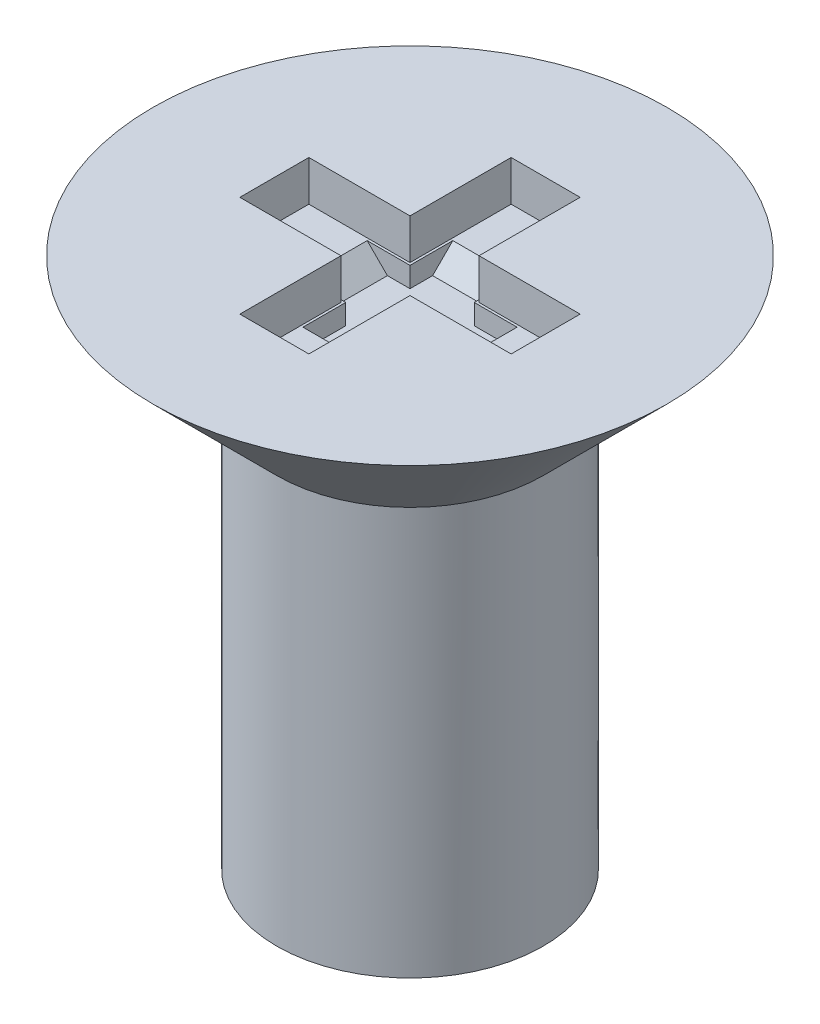
ISO-10303-21;
HEADER;
FILE_DESCRIPTION(('STEP AP214'),'2;1');
FILE_NAME('part.step','',(''),(''),'','','');
FILE_SCHEMA(('AUTOMOTIVE_DESIGN { 1 0 10303 214 1 1 1 1 }'));
ENDSEC;
DATA;
#1=APPLICATION_CONTEXT('core data for automotive mechanical design processes');
#2=APPLICATION_PROTOCOL_DEFINITION('international standard','automotive_design',2000,#1);
#3=PRODUCT_CONTEXT('',#1,'mechanical');
#4=PRODUCT('Part','Part','',(#3));
#5=PRODUCT_RELATED_PRODUCT_CATEGORY('part','',(#4));
#6=PRODUCT_DEFINITION_FORMATION('','',#4);
#7=PRODUCT_DEFINITION_CONTEXT('part definition',#1,'design');
#8=PRODUCT_DEFINITION('design','',#6,#7);
#9=PRODUCT_DEFINITION_SHAPE('','',#8);
#10=(LENGTH_UNIT() NAMED_UNIT(*) SI_UNIT(.MILLI.,.METRE.));
#11=(NAMED_UNIT(*) PLANE_ANGLE_UNIT() SI_UNIT($,.RADIAN.));
#12=(NAMED_UNIT(*) SI_UNIT($,.STERADIAN.) SOLID_ANGLE_UNIT());
#13=UNCERTAINTY_MEASURE_WITH_UNIT(LENGTH_MEASURE(1.E-05),#10,'distance_accuracy_value','');
#14=(GEOMETRIC_REPRESENTATION_CONTEXT(3) GLOBAL_UNCERTAINTY_ASSIGNED_CONTEXT((#13)) GLOBAL_UNIT_ASSIGNED_CONTEXT((#10,
#11,#12)) REPRESENTATION_CONTEXT('',''));
#15=CARTESIAN_POINT('',(0.,0.,0.));
#16=DIRECTION('',(0.,0.,1.));
#17=DIRECTION('',(1.,0.,0.));
#18=AXIS2_PLACEMENT_3D('',#15,#16,#17);
#19=CARTESIAN_POINT('',(-0.58416716291429,0.67306716291429,-0.3429));
#20=DIRECTION('',(0.,-1.,0.));
#21=DIRECTION('',(0.,0.,-1.));
#22=AXIS2_PLACEMENT_3D('',#19,#20,#21);
#23=PLANE('',#22);
#24=DIRECTION('',(1.,0.,0.));
#25=VECTOR('',#24,1.);
#26=CARTESIAN_POINT('',(-0.58416716291429,0.67306716291429,0.3429));
#27=LINE('',#26,#25);
#28=CARTESIAN_POINT('',(-0.58416716291429,0.67306716291429,0.3429));
#29=VERTEX_POINT('',#28);
#30=CARTESIAN_POINT('',(-0.3429,0.67306716291429,0.3429));
#31=VERTEX_POINT('',#30);
#32=EDGE_CURVE('E182',#29,#31,#27,.T.);
#33=ORIENTED_EDGE('',*,*,#32,.T.);
#34=DIRECTION('',(0.,0.,-1.));
#35=VECTOR('',#34,1.);
#36=CARTESIAN_POINT('',(-0.3429,0.67306716291429,0.));
#37=LINE('',#36,#35);
#38=CARTESIAN_POINT('',(-0.3429,0.67306716291429,0.58416716291429));
#39=VERTEX_POINT('',#38);
#40=EDGE_CURVE('E20',#39,#31,#37,.T.);
#41=ORIENTED_EDGE('',*,*,#40,.F.);
#42=DIRECTION('',(1.,0.,0.));
#43=VECTOR('',#42,1.);
#44=CARTESIAN_POINT('',(-0.3429,0.67306716291429,0.58416716291429));
#45=LINE('',#44,#43);
#46=CARTESIAN_POINT('',(0.3429,0.67306716291429,0.58416716291429));
#47=VERTEX_POINT('',#46);
#48=EDGE_CURVE('E179',#39,#47,#45,.T.);
#49=ORIENTED_EDGE('',*,*,#48,.T.);
#50=DIRECTION('',(0.,0.,-1.));
#51=VECTOR('',#50,1.);
#52=CARTESIAN_POINT('',(0.3429,0.67306716291429,-0.3429));
#53=LINE('',#52,#51);
#54=CARTESIAN_POINT('',(0.3429,0.67306716291429,0.3429));
#55=VERTEX_POINT('',#54);
#56=EDGE_CURVE('E194',#47,#55,#53,.T.);
#57=ORIENTED_EDGE('',*,*,#56,.T.);
#58=DIRECTION('',(1.,0.,0.));
#59=VECTOR('',#58,1.);
#60=CARTESIAN_POINT('',(-0.58416716291429,0.67306716291429,0.3429));
#61=LINE('',#60,#59);
#62=CARTESIAN_POINT('',(0.58416716291429,0.67306716291429,0.3429));
#63=VERTEX_POINT('',#62);
#64=EDGE_CURVE('E206',#55,#63,#61,.T.);
#65=ORIENTED_EDGE('',*,*,#64,.T.);
#66=DIRECTION('',(0.,0.,1.));
#67=VECTOR('',#66,1.);
#68=CARTESIAN_POINT('',(0.58416716291429,0.67306716291429,-0.3429));
#69=LINE('',#68,#67);
#70=CARTESIAN_POINT('',(0.58416716291429,0.67306716291429,-0.3429));
#71=VERTEX_POINT('',#70);
#72=EDGE_CURVE('E209',#63,#71,#69,.F.);
#73=ORIENTED_EDGE('',*,*,#72,.T.);
#74=DIRECTION('',(1.,0.,0.));
#75=VECTOR('',#74,1.);
#76=CARTESIAN_POINT('',(0.,0.67306716291429,-0.3429));
#77=LINE('',#76,#75);
#78=CARTESIAN_POINT('',(0.3429,0.67306716291429,-0.3429));
#79=VERTEX_POINT('',#78);
#80=EDGE_CURVE('E210',#79,#71,#77,.T.);
#81=ORIENTED_EDGE('',*,*,#80,.F.);
#82=DIRECTION('',(0.,0.,-1.));
#83=VECTOR('',#82,1.);
#84=CARTESIAN_POINT('',(0.3429,0.67306716291429,-0.3429));
#85=LINE('',#84,#83);
#86=CARTESIAN_POINT('',(0.3429,0.67306716291429,-0.58416716291429));
#87=VERTEX_POINT('',#86);
#88=EDGE_CURVE('E215',#79,#87,#85,.T.);
#89=ORIENTED_EDGE('',*,*,#88,.T.);
#90=DIRECTION('',(-1.,0.,0.));
#91=VECTOR('',#90,1.);
#92=CARTESIAN_POINT('',(-0.3429,0.67306716291429,-0.58416716291429));
#93=LINE('',#92,#91);
#94=CARTESIAN_POINT('',(-0.3429,0.67306716291429,-0.58416716291429));
#95=VERTEX_POINT('',#94);
#96=EDGE_CURVE('E217',#87,#95,#93,.T.);
#97=ORIENTED_EDGE('',*,*,#96,.T.);
#98=DIRECTION('',(0.,0.,-1.));
#99=VECTOR('',#98,1.);
#100=CARTESIAN_POINT('',(-0.3429,0.67306716291429,0.));
#101=LINE('',#100,#99);
#102=CARTESIAN_POINT('',(-0.3429,0.67306716291429,-0.3429));
#103=VERTEX_POINT('',#102);
#104=EDGE_CURVE('E223',#103,#95,#101,.T.);
#105=ORIENTED_EDGE('',*,*,#104,.F.);
#106=DIRECTION('',(1.,0.,0.));
#107=VECTOR('',#106,1.);
#108=CARTESIAN_POINT('',(0.,0.67306716291429,-0.3429));
#109=LINE('',#108,#107);
#110=CARTESIAN_POINT('',(-0.58416716291429,0.67306716291429,-0.3429));
#111=VERTEX_POINT('',#110);
#112=EDGE_CURVE('E225',#111,#103,#109,.T.);
#113=ORIENTED_EDGE('',*,*,#112,.F.);
#114=DIRECTION('',(0.,0.,1.));
#115=VECTOR('',#114,1.);
#116=CARTESIAN_POINT('',(-0.58416716291429,0.67306716291429,-0.3429));
#117=LINE('',#116,#115);
#118=EDGE_CURVE('E228',#111,#29,#117,.T.);
#119=ORIENTED_EDGE('',*,*,#118,.T.);
#120=EDGE_LOOP('',(#33,#41,#49,#57,#65,#73,#81,#89,#97,#105,#113,#119));
#121=FACE_BOUND('',#120,.T.);
#122=ADVANCED_FACE('F17',(#121),#23,.F.);
#123=CARTESIAN_POINT('',(0.,-4.350004,0.));
#124=DIRECTION('',(0.,1.,0.));
#125=DIRECTION('',(0.,0.,1.));
#126=AXIS2_PLACEMENT_3D('',#123,#124,#125);
#127=PLANE('',#126);
#128=CARTESIAN_POINT('',(0.,-4.350004,0.));
#129=DIRECTION('',(0.,1.,0.));
#130=DIRECTION('',(0.,0.,1.));
#131=AXIS2_PLACEMENT_3D('',#128,#129,#130);
#132=CIRCLE('',#131,1.4224);
#133=CARTESIAN_POINT('',(0.,-4.350004,1.4224));
#134=VERTEX_POINT('',#133);
#135=EDGE_CURVE('E200',#134,#134,#132,.T.);
#136=ORIENTED_EDGE('',*,*,#135,.F.);
#137=EDGE_LOOP('',(#136));
#138=FACE_BOUND('',#137,.T.);
#139=ADVANCED_FACE('F553',(#138),#127,.F.);
#140=CARTESIAN_POINT('',(-0.3429,0.,0.));
#141=DIRECTION('',(1.,0.,0.));
#142=DIRECTION('',(0.,0.,-1.));
#143=AXIS2_PLACEMENT_3D('',#140,#141,#142);
#144=PLANE('',#143);
#145=ORIENTED_EDGE('',*,*,#40,.T.);
#146=DIRECTION('',(0.,1.,0.));
#147=VECTOR('',#146,1.);
#148=CARTESIAN_POINT('',(-0.3429,0.,0.3429));
#149=LINE('',#148,#147);
#150=CARTESIAN_POINT('',(-0.3429,0.889,0.3429));
#151=VERTEX_POINT('',#150);
#152=EDGE_CURVE('E185',#31,#151,#149,.T.);
#153=ORIENTED_EDGE('',*,*,#152,.T.);
#154=DIRECTION('',(0.,0.,1.));
#155=VECTOR('',#154,1.);
#156=CARTESIAN_POINT('',(-0.3429,0.889,0.));
#157=LINE('',#156,#155);
#158=CARTESIAN_POINT('',(-0.3429,0.889,0.8001));
#159=VERTEX_POINT('',#158);
#160=EDGE_CURVE('E190',#159,#151,#157,.F.);
#161=ORIENTED_EDGE('',*,*,#160,.F.);
#162=DIRECTION('',(0.,-0.707106781186548,-0.707106781186548));
#163=VECTOR('',#162,1.);
#164=CARTESIAN_POINT('',(-0.3429,0.889,0.8001));
#165=LINE('',#164,#163);
#166=EDGE_CURVE('E187',#159,#39,#165,.T.);
#167=ORIENTED_EDGE('',*,*,#166,.T.);
#168=EDGE_LOOP('',(#145,#153,#161,#167));
#169=FACE_BOUND('',#168,.T.);
#170=ADVANCED_FACE('F188',(#169),#144,.T.);
#171=CARTESIAN_POINT('',(0.,0.,0.3429));
#172=DIRECTION('',(0.,0.,1.));
#173=DIRECTION('',(1.,0.,0.));
#174=AXIS2_PLACEMENT_3D('',#171,#172,#173);
#175=PLANE('',#174);
#176=DIRECTION('',(0.707106781186548,-0.707106781186548,0.));
#177=VECTOR('',#176,1.);
#178=CARTESIAN_POINT('',(-1.2319,1.3208,0.3429));
#179=LINE('',#178,#177);
#180=CARTESIAN_POINT('',(-0.8001,0.889,0.3429));
#181=VERTEX_POINT('',#180);
#182=EDGE_CURVE('E229',#29,#181,#179,.F.);
#183=ORIENTED_EDGE('',*,*,#182,.T.);
#184=DIRECTION('',(1.,0.,0.));
#185=VECTOR('',#184,1.);
#186=CARTESIAN_POINT('',(0.,0.889,0.3429));
#187=LINE('',#186,#185);
#188=EDGE_CURVE('E238',#151,#181,#187,.F.);
#189=ORIENTED_EDGE('',*,*,#188,.F.);
#190=ORIENTED_EDGE('',*,*,#152,.F.);
#191=ORIENTED_EDGE('',*,*,#32,.F.);
#192=EDGE_LOOP('',(#183,#189,#190,#191));
#193=FACE_BOUND('',#192,.T.);
#194=ADVANCED_FACE('F548',(#193),#175,.F.);
#195=CARTESIAN_POINT('',(-1.2319,1.3208,-0.3429));
#196=DIRECTION('',(-0.707106781186548,-0.707106781186548,0.));
#197=DIRECTION('',(0.707106781186548,-0.707106781186548,0.));
#198=AXIS2_PLACEMENT_3D('',#195,#196,#197);
#199=PLANE('',#198);
#200=ORIENTED_EDGE('',*,*,#182,.F.);
#201=ORIENTED_EDGE('',*,*,#118,.F.);
#202=DIRECTION('',(0.707106781186548,-0.707106781186548,0.));
#203=VECTOR('',#202,1.);
#204=CARTESIAN_POINT('',(-0.8001,0.889,-0.3429));
#205=LINE('',#204,#203);
#206=CARTESIAN_POINT('',(-0.8001,0.889,-0.3429));
#207=VERTEX_POINT('',#206);
#208=EDGE_CURVE('E227',#207,#111,#205,.T.);
#209=ORIENTED_EDGE('',*,*,#208,.F.);
#210=DIRECTION('',(0.,0.,1.));
#211=VECTOR('',#210,1.);
#212=CARTESIAN_POINT('',(-0.8001,0.889,0.));
#213=LINE('',#212,#211);
#214=EDGE_CURVE('E241',#181,#207,#213,.F.);
#215=ORIENTED_EDGE('',*,*,#214,.F.);
#216=EDGE_LOOP('',(#200,#201,#209,#215));
#217=FACE_BOUND('',#216,.T.);
#218=ADVANCED_FACE('F315',(#217),#199,.F.);
#219=CARTESIAN_POINT('',(0.,0.,-0.3429));
#220=DIRECTION('',(0.,0.,1.));
#221=DIRECTION('',(1.,0.,0.));
#222=AXIS2_PLACEMENT_3D('',#219,#220,#221);
#223=PLANE('',#222);
#224=ORIENTED_EDGE('',*,*,#112,.T.);
#225=DIRECTION('',(0.,1.,0.));
#226=VECTOR('',#225,1.);
#227=CARTESIAN_POINT('',(-0.3429,0.,-0.3429));
#228=LINE('',#227,#226);
#229=CARTESIAN_POINT('',(-0.3429,0.889,-0.3429));
#230=VERTEX_POINT('',#229);
#231=EDGE_CURVE('E222',#230,#103,#228,.F.);
#232=ORIENTED_EDGE('',*,*,#231,.F.);
#233=DIRECTION('',(1.,0.,0.));
#234=VECTOR('',#233,1.);
#235=CARTESIAN_POINT('',(0.,0.889,-0.3429));
#236=LINE('',#235,#234);
#237=EDGE_CURVE('E295',#207,#230,#236,.T.);
#238=ORIENTED_EDGE('',*,*,#237,.F.);
#239=ORIENTED_EDGE('',*,*,#208,.T.);
#240=EDGE_LOOP('',(#224,#232,#238,#239));
#241=FACE_BOUND('',#240,.T.);
#242=ADVANCED_FACE('F318',(#241),#223,.T.);
#243=CARTESIAN_POINT('',(-0.3429,0.,0.));
#244=DIRECTION('',(1.,0.,0.));
#245=DIRECTION('',(0.,0.,-1.));
#246=AXIS2_PLACEMENT_3D('',#243,#244,#245);
#247=PLANE('',#246);
#248=DIRECTION('',(0.,0.,1.));
#249=VECTOR('',#248,1.);
#250=CARTESIAN_POINT('',(-0.3429,0.889,0.));
#251=LINE('',#250,#249);
#252=CARTESIAN_POINT('',(-0.3429,0.889,-0.8001));
#253=VERTEX_POINT('',#252);
#254=EDGE_CURVE('E292',#230,#253,#251,.F.);
#255=ORIENTED_EDGE('',*,*,#254,.F.);
#256=ORIENTED_EDGE('',*,*,#231,.T.);
#257=ORIENTED_EDGE('',*,*,#104,.T.);
#258=DIRECTION('',(0.,0.707106781186548,-0.707106781186547));
#259=VECTOR('',#258,1.);
#260=CARTESIAN_POINT('',(-0.3429,0.673094527152424,-0.584194527152424));
#261=LINE('',#260,#259);
#262=EDGE_CURVE('E220',#95,#253,#261,.T.);
#263=ORIENTED_EDGE('',*,*,#262,.T.);
#264=EDGE_LOOP('',(#255,#256,#257,#263));
#265=FACE_BOUND('',#264,.T.);
#266=ADVANCED_FACE('F321',(#265),#247,.T.);
#267=CARTESIAN_POINT('',(-0.3429,0.6731,-0.5842));
#268=DIRECTION('',(0.,-0.707106781186548,-0.707106781186548));
#269=DIRECTION('',(0.,0.707106781186548,-0.707106781186548));
#270=AXIS2_PLACEMENT_3D('',#267,#268,#269);
#271=PLANE('',#270);
#272=DIRECTION('',(0.,0.707106781186548,-0.707106781186548));
#273=VECTOR('',#272,1.);
#274=CARTESIAN_POINT('',(0.3429,0.6731,-0.5842));
#275=LINE('',#274,#273);
#276=CARTESIAN_POINT('',(0.3429,0.889,-0.8001));
#277=VERTEX_POINT('',#276);
#278=EDGE_CURVE('E213',#87,#277,#275,.T.);
#279=ORIENTED_EDGE('',*,*,#278,.T.);
#280=DIRECTION('',(1.,0.,0.));
#281=VECTOR('',#280,1.);
#282=CARTESIAN_POINT('',(0.,0.889,-0.8001));
#283=LINE('',#282,#281);
#284=EDGE_CURVE('E289',#253,#277,#283,.T.);
#285=ORIENTED_EDGE('',*,*,#284,.F.);
#286=ORIENTED_EDGE('',*,*,#262,.F.);
#287=ORIENTED_EDGE('',*,*,#96,.F.);
#288=EDGE_LOOP('',(#279,#285,#286,#287));
#289=FACE_BOUND('',#288,.T.);
#290=ADVANCED_FACE('F326',(#289),#271,.F.);
#291=CARTESIAN_POINT('',(0.3429,0.,0.));
#292=DIRECTION('',(1.,0.,0.));
#293=DIRECTION('',(0.,0.,-1.));
#294=AXIS2_PLACEMENT_3D('',#291,#292,#293);
#295=PLANE('',#294);
#296=ORIENTED_EDGE('',*,*,#278,.F.);
#297=ORIENTED_EDGE('',*,*,#88,.F.);
#298=DIRECTION('',(0.,1.,0.));
#299=VECTOR('',#298,1.);
#300=CARTESIAN_POINT('',(0.3429,0.,-0.3429));
#301=LINE('',#300,#299);
#302=CARTESIAN_POINT('',(0.3429,0.889,-0.3429));
#303=VERTEX_POINT('',#302);
#304=EDGE_CURVE('E212',#303,#79,#301,.F.);
#305=ORIENTED_EDGE('',*,*,#304,.F.);
#306=DIRECTION('',(0.,0.,1.));
#307=VECTOR('',#306,1.);
#308=CARTESIAN_POINT('',(0.3429,0.889,0.));
#309=LINE('',#308,#307);
#310=EDGE_CURVE('E282',#277,#303,#309,.T.);
#311=ORIENTED_EDGE('',*,*,#310,.F.);
#312=EDGE_LOOP('',(#296,#297,#305,#311));
#313=FACE_BOUND('',#312,.T.);
#314=ADVANCED_FACE('F331',(#313),#295,.F.);
#315=CARTESIAN_POINT('',(0.,0.,-0.3429));
#316=DIRECTION('',(0.,0.,1.));
#317=DIRECTION('',(1.,0.,0.));
#318=AXIS2_PLACEMENT_3D('',#315,#316,#317);
#319=PLANE('',#318);
#320=DIRECTION('',(1.,0.,0.));
#321=VECTOR('',#320,1.);
#322=CARTESIAN_POINT('',(0.,0.889,-0.3429));
#323=LINE('',#322,#321);
#324=CARTESIAN_POINT('',(0.8001,0.889,-0.3429));
#325=VERTEX_POINT('',#324);
#326=EDGE_CURVE('E277',#303,#325,#323,.T.);
#327=ORIENTED_EDGE('',*,*,#326,.F.);
#328=ORIENTED_EDGE('',*,*,#304,.T.);
#329=ORIENTED_EDGE('',*,*,#80,.T.);
#330=DIRECTION('',(0.707106781186548,0.707106781186548,0.));
#331=VECTOR('',#330,1.);
#332=CARTESIAN_POINT('',(0.58416716291429,0.67306716291429,-0.3429));
#333=LINE('',#332,#331);
#334=EDGE_CURVE('E270',#71,#325,#333,.T.);
#335=ORIENTED_EDGE('',*,*,#334,.T.);
#336=EDGE_LOOP('',(#327,#328,#329,#335));
#337=FACE_BOUND('',#336,.T.);
#338=ADVANCED_FACE('F334',(#337),#319,.T.);
#339=CARTESIAN_POINT('',(0.58416716291429,0.67306716291429,-0.3429));
#340=DIRECTION('',(0.707106781186548,-0.707106781186548,0.));
#341=DIRECTION('',(0.707106781186548,0.707106781186548,0.));
#342=AXIS2_PLACEMENT_3D('',#339,#340,#341);
#343=PLANE('',#342);
#344=DIRECTION('',(0.707106781186548,0.707106781186548,0.));
#345=VECTOR('',#344,1.);
#346=CARTESIAN_POINT('',(0.58416716291429,0.67306716291429,0.3429));
#347=LINE('',#346,#345);
#348=CARTESIAN_POINT('',(0.8001,0.889,0.3429));
#349=VERTEX_POINT('',#348);
#350=EDGE_CURVE('E208',#63,#349,#347,.T.);
#351=ORIENTED_EDGE('',*,*,#350,.T.);
#352=DIRECTION('',(0.,0.,1.));
#353=VECTOR('',#352,1.);
#354=CARTESIAN_POINT('',(0.8001,0.889,0.));
#355=LINE('',#354,#353);
#356=EDGE_CURVE('E265',#325,#349,#355,.T.);
#357=ORIENTED_EDGE('',*,*,#356,.F.);
#358=ORIENTED_EDGE('',*,*,#334,.F.);
#359=ORIENTED_EDGE('',*,*,#72,.F.);
#360=EDGE_LOOP('',(#351,#357,#358,#359));
#361=FACE_BOUND('',#360,.T.);
#362=ADVANCED_FACE('F339',(#361),#343,.F.);
#363=CARTESIAN_POINT('',(0.,0.,0.3429));
#364=DIRECTION('',(0.,0.,1.));
#365=DIRECTION('',(1.,0.,0.));
#366=AXIS2_PLACEMENT_3D('',#363,#364,#365);
#367=PLANE('',#366);
#368=ORIENTED_EDGE('',*,*,#350,.F.);
#369=ORIENTED_EDGE('',*,*,#64,.F.);
#370=DIRECTION('',(0.,1.,0.));
#371=VECTOR('',#370,1.);
#372=CARTESIAN_POINT('',(0.3429,0.,0.3429));
#373=LINE('',#372,#371);
#374=CARTESIAN_POINT('',(0.3429,0.889,0.3429));
#375=VERTEX_POINT('',#374);
#376=EDGE_CURVE('E205',#55,#375,#373,.T.);
#377=ORIENTED_EDGE('',*,*,#376,.T.);
#378=DIRECTION('',(1.,0.,0.));
#379=VECTOR('',#378,1.);
#380=CARTESIAN_POINT('',(0.,0.889,0.3429));
#381=LINE('',#380,#379);
#382=EDGE_CURVE('E261',#349,#375,#381,.F.);
#383=ORIENTED_EDGE('',*,*,#382,.F.);
#384=EDGE_LOOP('',(#368,#369,#377,#383));
#385=FACE_BOUND('',#384,.T.);
#386=ADVANCED_FACE('F343',(#385),#367,.F.);
#387=CARTESIAN_POINT('',(0.3429,0.,0.));
#388=DIRECTION('',(1.,0.,0.));
#389=DIRECTION('',(0.,0.,-1.));
#390=AXIS2_PLACEMENT_3D('',#387,#388,#389);
#391=PLANE('',#390);
#392=DIRECTION('',(0.,0.707106781186548,0.707106781186548));
#393=VECTOR('',#392,1.);
#394=CARTESIAN_POINT('',(0.3429,0.673094527152424,0.584194527152424));
#395=LINE('',#394,#393);
#396=CARTESIAN_POINT('',(0.3429,0.889,0.8001));
#397=VERTEX_POINT('',#396);
#398=EDGE_CURVE('E198',#47,#397,#395,.T.);
#399=ORIENTED_EDGE('',*,*,#398,.T.);
#400=DIRECTION('',(0.,0.,1.));
#401=VECTOR('',#400,1.);
#402=CARTESIAN_POINT('',(0.3429,0.889,0.));
#403=LINE('',#402,#401);
#404=EDGE_CURVE('E264',#375,#397,#403,.T.);
#405=ORIENTED_EDGE('',*,*,#404,.F.);
#406=ORIENTED_EDGE('',*,*,#376,.F.);
#407=ORIENTED_EDGE('',*,*,#56,.F.);
#408=EDGE_LOOP('',(#399,#405,#406,#407));
#409=FACE_BOUND('',#408,.T.);
#410=ADVANCED_FACE('F347',(#409),#391,.F.);
#411=CARTESIAN_POINT('',(-0.3429,1.3208,1.2319));
#412=DIRECTION('',(0.,-0.707106781186548,0.707106781186548));
#413=DIRECTION('',(0.,-0.707106781186548,-0.707106781186548));
#414=AXIS2_PLACEMENT_3D('',#411,#412,#413);
#415=PLANE('',#414);
#416=ORIENTED_EDGE('',*,*,#398,.F.);
#417=ORIENTED_EDGE('',*,*,#48,.F.);
#418=ORIENTED_EDGE('',*,*,#166,.F.);
#419=DIRECTION('',(1.,0.,0.));
#420=VECTOR('',#419,1.);
#421=CARTESIAN_POINT('',(0.,0.889,0.8001));
#422=LINE('',#421,#420);
#423=EDGE_CURVE('E348',#397,#159,#422,.F.);
#424=ORIENTED_EDGE('',*,*,#423,.F.);
#425=EDGE_LOOP('',(#416,#417,#418,#424));
#426=FACE_BOUND('',#425,.T.);
#427=ADVANCED_FACE('F197',(#426),#415,.F.);
#428=CARTESIAN_POINT('',(0.,0.,0.));
#429=DIRECTION('',(0.,1.,0.));
#430=DIRECTION('',(0.,0.,1.));
#431=AXIS2_PLACEMENT_3D('',#428,#429,#430);
#432=CYLINDRICAL_SURFACE('',#431,1.4224);
#433=ORIENTED_EDGE('',*,*,#135,.T.);
#434=EDGE_LOOP('',(#433));
#435=FACE_BOUND('',#434,.T.);
#436=CARTESIAN_POINT('',(0.,0.,0.));
#437=DIRECTION('',(0.,1.,0.));
#438=DIRECTION('',(1.,0.,0.));
#439=AXIS2_PLACEMENT_3D('',#436,#437,#438);
#440=CIRCLE('',#439,1.42239999996718);
#441=CARTESIAN_POINT('',(1.42239999996718,0.,0.));
#442=VERTEX_POINT('',#441);
#443=EDGE_CURVE('E349',#442,#442,#440,.T.);
#444=ORIENTED_EDGE('',*,*,#443,.F.);
#445=EDGE_LOOP('',(#444));
#446=FACE_BOUND('',#445,.T.);
#447=ADVANCED_FACE('F525',(#435,#446),#432,.T.);
#448=CARTESIAN_POINT('',(0.,0.889,0.));
#449=DIRECTION('',(0.,1.,0.));
#450=DIRECTION('',(0.,0.,1.));
#451=AXIS2_PLACEMENT_3D('',#448,#449,#450);
#452=PLANE('',#451);
#453=ORIENTED_EDGE('',*,*,#404,.T.);
#454=ORIENTED_EDGE('',*,*,#423,.T.);
#455=ORIENTED_EDGE('',*,*,#160,.T.);
#456=ORIENTED_EDGE('',*,*,#188,.T.);
#457=ORIENTED_EDGE('',*,*,#214,.T.);
#458=ORIENTED_EDGE('',*,*,#237,.T.);
#459=ORIENTED_EDGE('',*,*,#254,.T.);
#460=ORIENTED_EDGE('',*,*,#284,.T.);
#461=ORIENTED_EDGE('',*,*,#310,.T.);
#462=ORIENTED_EDGE('',*,*,#326,.T.);
#463=ORIENTED_EDGE('',*,*,#356,.T.);
#464=ORIENTED_EDGE('',*,*,#382,.T.);
#465=EDGE_LOOP('',(#453,#454,#455,#456,#457,#458,#459,#460,#461,#462,#463,#464));
#466=FACE_BOUND('',#465,.T.);
#467=DIRECTION('',(-1.,0.,0.));
#468=VECTOR('',#467,1.);
#469=CARTESIAN_POINT('',(0.3683,0.889,-1.4478));
#470=LINE('',#469,#468);
#471=CARTESIAN_POINT('',(0.3683,0.889,-1.4478));
#472=VERTEX_POINT('',#471);
#473=CARTESIAN_POINT('',(-0.3683,0.889,-1.4478));
#474=VERTEX_POINT('',#473);
#475=EDGE_CURVE('E354',#472,#474,#470,.T.);
#476=ORIENTED_EDGE('',*,*,#475,.T.);
#477=DIRECTION('',(0.,0.,1.));
#478=VECTOR('',#477,1.);
#479=CARTESIAN_POINT('',(-0.3683,0.889,-1.4478));
#480=LINE('',#479,#478);
#481=CARTESIAN_POINT('',(-0.3683,0.889,-0.3683));
#482=VERTEX_POINT('',#481);
#483=EDGE_CURVE('E399',#474,#482,#480,.T.);
#484=ORIENTED_EDGE('',*,*,#483,.T.);
#485=DIRECTION('',(-1.,0.,0.));
#486=VECTOR('',#485,1.);
#487=CARTESIAN_POINT('',(-0.3683,0.889,-0.3683));
#488=LINE('',#487,#486);
#489=CARTESIAN_POINT('',(-1.4478,0.889,-0.3683));
#490=VERTEX_POINT('',#489);
#491=EDGE_CURVE('E392',#482,#490,#488,.T.);
#492=ORIENTED_EDGE('',*,*,#491,.T.);
#493=DIRECTION('',(0.,0.,1.));
#494=VECTOR('',#493,1.);
#495=CARTESIAN_POINT('',(-1.4478,0.889,-0.3683));
#496=LINE('',#495,#494);
#497=CARTESIAN_POINT('',(-1.4478,0.889,0.3683));
#498=VERTEX_POINT('',#497);
#499=EDGE_CURVE('E388',#490,#498,#496,.T.);
#500=ORIENTED_EDGE('',*,*,#499,.T.);
#501=DIRECTION('',(1.,0.,0.));
#502=VECTOR('',#501,1.);
#503=CARTESIAN_POINT('',(-1.4478,0.889,0.3683));
#504=LINE('',#503,#502);
#505=CARTESIAN_POINT('',(-0.3683,0.889,0.3683));
#506=VERTEX_POINT('',#505);
#507=EDGE_CURVE('E384',#498,#506,#504,.T.);
#508=ORIENTED_EDGE('',*,*,#507,.T.);
#509=DIRECTION('',(0.,0.,1.));
#510=VECTOR('',#509,1.);
#511=CARTESIAN_POINT('',(-0.3683,0.889,0.3683));
#512=LINE('',#511,#510);
#513=CARTESIAN_POINT('',(-0.3683,0.889,1.4478));
#514=VERTEX_POINT('',#513);
#515=EDGE_CURVE('E380',#506,#514,#512,.T.);
#516=ORIENTED_EDGE('',*,*,#515,.T.);
#517=DIRECTION('',(1.,0.,0.));
#518=VECTOR('',#517,1.);
#519=CARTESIAN_POINT('',(-0.3683,0.889,1.4478));
#520=LINE('',#519,#518);
#521=CARTESIAN_POINT('',(0.3683,0.889,1.4478));
#522=VERTEX_POINT('',#521);
#523=EDGE_CURVE('E376',#514,#522,#520,.T.);
#524=ORIENTED_EDGE('',*,*,#523,.T.);
#525=DIRECTION('',(0.,0.,-1.));
#526=VECTOR('',#525,1.);
#527=CARTESIAN_POINT('',(0.3683,0.889,1.4478));
#528=LINE('',#527,#526);
#529=CARTESIAN_POINT('',(0.3683,0.889,0.3683));
#530=VERTEX_POINT('',#529);
#531=EDGE_CURVE('E372',#522,#530,#528,.T.);
#532=ORIENTED_EDGE('',*,*,#531,.T.);
#533=DIRECTION('',(1.,0.,0.));
#534=VECTOR('',#533,1.);
#535=CARTESIAN_POINT('',(0.3683,0.889,0.3683));
#536=LINE('',#535,#534);
#537=CARTESIAN_POINT('',(1.4478,0.889,0.3683));
#538=VERTEX_POINT('',#537);
#539=EDGE_CURVE('E368',#530,#538,#536,.T.);
#540=ORIENTED_EDGE('',*,*,#539,.T.);
#541=DIRECTION('',(0.,0.,-1.));
#542=VECTOR('',#541,1.);
#543=CARTESIAN_POINT('',(1.4478,0.889,0.3683));
#544=LINE('',#543,#542);
#545=CARTESIAN_POINT('',(1.4478,0.889,-0.3683));
#546=VERTEX_POINT('',#545);
#547=EDGE_CURVE('E364',#538,#546,#544,.T.);
#548=ORIENTED_EDGE('',*,*,#547,.T.);
#549=DIRECTION('',(-1.,0.,0.));
#550=VECTOR('',#549,1.);
#551=CARTESIAN_POINT('',(1.4478,0.889,-0.3683));
#552=LINE('',#551,#550);
#553=CARTESIAN_POINT('',(0.3683,0.889,-0.3683));
#554=VERTEX_POINT('',#553);
#555=EDGE_CURVE('E360',#546,#554,#552,.T.);
#556=ORIENTED_EDGE('',*,*,#555,.T.);
#557=DIRECTION('',(0.,0.,-1.));
#558=VECTOR('',#557,1.);
#559=CARTESIAN_POINT('',(0.3683,0.889,-0.3683));
#560=LINE('',#559,#558);
#561=EDGE_CURVE('E356',#554,#472,#560,.T.);
#562=ORIENTED_EDGE('',*,*,#561,.T.);
#563=EDGE_LOOP('',(#476,#484,#492,#500,#508,#516,#524,#532,#540,#548,#556,#562));
#564=FACE_BOUND('',#563,.T.);
#565=ADVANCED_FACE('F310',(#466,#564),#452,.T.);
#566=CARTESIAN_POINT('',(0.,1.32079999991674,0.));
#567=DIRECTION('',(0.,1.,0.));
#568=DIRECTION('',(0.,0.,1.));
#569=AXIS2_PLACEMENT_3D('',#566,#567,#568);
#570=CONICAL_SURFACE('',#569,2.74319999988393,0.785398163397448);
#571=CARTESIAN_POINT('',(0.,1.32080000003043,0.));
#572=DIRECTION('',(0.,1.,0.));
#573=DIRECTION('',(0.,0.,1.));
#574=AXIS2_PLACEMENT_3D('',#571,#572,#573);
#575=CIRCLE('',#574,2.74319999999761);
#576=CARTESIAN_POINT('',(0.,1.32080000003043,2.74319999999761));
#577=VERTEX_POINT('',#576);
#578=EDGE_CURVE('E244',#577,#577,#575,.T.);
#579=ORIENTED_EDGE('',*,*,#578,.F.);
#580=EDGE_LOOP('',(#579));
#581=FACE_BOUND('',#580,.T.);
#582=ORIENTED_EDGE('',*,*,#443,.T.);
#583=EDGE_LOOP('',(#582));
#584=FACE_BOUND('',#583,.T.);
#585=ADVANCED_FACE('F519',(#581,#584),#570,.T.);
#586=CARTESIAN_POINT('',(0.3683,2.921,-1.4478));
#587=DIRECTION('',(0.,0.,-1.));
#588=DIRECTION('',(-1.,0.,0.));
#589=AXIS2_PLACEMENT_3D('',#586,#587,#588);
#590=PLANE('',#589);
#591=ORIENTED_EDGE('',*,*,#475,.F.);
#592=DIRECTION('',(0.,1.,0.));
#593=VECTOR('',#592,1.);
#594=CARTESIAN_POINT('',(0.3683,2.921,-1.4478));
#595=LINE('',#594,#593);
#596=CARTESIAN_POINT('',(0.3683,1.3208,-1.4478));
#597=VERTEX_POINT('',#596);
#598=EDGE_CURVE('E358',#472,#597,#595,.T.);
#599=ORIENTED_EDGE('',*,*,#598,.T.);
#600=DIRECTION('',(1.,0.,0.));
#601=VECTOR('',#600,1.);
#602=CARTESIAN_POINT('',(0.,1.3208,-1.4478));
#603=LINE('',#602,#601);
#604=CARTESIAN_POINT('',(-0.3683,1.3208,-1.4478));
#605=VERTEX_POINT('',#604);
#606=EDGE_CURVE('E246',#605,#597,#603,.T.);
#607=ORIENTED_EDGE('',*,*,#606,.F.);
#608=DIRECTION('',(0.,1.,0.));
#609=VECTOR('',#608,1.);
#610=CARTESIAN_POINT('',(-0.3683,2.921,-1.4478));
#611=LINE('',#610,#609);
#612=EDGE_CURVE('E396',#605,#474,#611,.F.);
#613=ORIENTED_EDGE('',*,*,#612,.T.);
#614=EDGE_LOOP('',(#591,#599,#607,#613));
#615=FACE_BOUND('',#614,.T.);
#616=ADVANCED_FACE('F484',(#615),#590,.F.);
#617=CARTESIAN_POINT('',(0.3683,2.921,-0.3683));
#618=DIRECTION('',(1.,0.,0.));
#619=DIRECTION('',(0.,0.,-1.));
#620=AXIS2_PLACEMENT_3D('',#617,#618,#619);
#621=PLANE('',#620);
#622=ORIENTED_EDGE('',*,*,#561,.F.);
#623=DIRECTION('',(0.,1.,0.));
#624=VECTOR('',#623,1.);
#625=CARTESIAN_POINT('',(0.3683,2.921,-0.3683));
#626=LINE('',#625,#624);
#627=CARTESIAN_POINT('',(0.3683,1.3208,-0.3683));
#628=VERTEX_POINT('',#627);
#629=EDGE_CURVE('E362',#554,#628,#626,.T.);
#630=ORIENTED_EDGE('',*,*,#629,.T.);
#631=DIRECTION('',(0.,0.,1.));
#632=VECTOR('',#631,1.);
#633=CARTESIAN_POINT('',(0.3683,1.3208,0.));
#634=LINE('',#633,#632);
#635=EDGE_CURVE('E404',#597,#628,#634,.T.);
#636=ORIENTED_EDGE('',*,*,#635,.F.);
#637=ORIENTED_EDGE('',*,*,#598,.F.);
#638=EDGE_LOOP('',(#622,#630,#636,#637));
#639=FACE_BOUND('',#638,.T.);
#640=ADVANCED_FACE('F480',(#639),#621,.F.);
#641=CARTESIAN_POINT('',(1.4478,2.921,-0.3683));
#642=DIRECTION('',(0.,0.,-1.));
#643=DIRECTION('',(-1.,0.,0.));
#644=AXIS2_PLACEMENT_3D('',#641,#642,#643);
#645=PLANE('',#644);
#646=ORIENTED_EDGE('',*,*,#555,.F.);
#647=DIRECTION('',(0.,1.,0.));
#648=VECTOR('',#647,1.);
#649=CARTESIAN_POINT('',(1.4478,2.921,-0.3683));
#650=LINE('',#649,#648);
#651=CARTESIAN_POINT('',(1.4478,1.3208,-0.3683));
#652=VERTEX_POINT('',#651);
#653=EDGE_CURVE('E366',#546,#652,#650,.T.);
#654=ORIENTED_EDGE('',*,*,#653,.T.);
#655=DIRECTION('',(1.,0.,0.));
#656=VECTOR('',#655,1.);
#657=CARTESIAN_POINT('',(0.,1.3208,-0.3683));
#658=LINE('',#657,#656);
#659=EDGE_CURVE('E407',#628,#652,#658,.T.);
#660=ORIENTED_EDGE('',*,*,#659,.F.);
#661=ORIENTED_EDGE('',*,*,#629,.F.);
#662=EDGE_LOOP('',(#646,#654,#660,#661));
#663=FACE_BOUND('',#662,.T.);
#664=ADVANCED_FACE('F476',(#663),#645,.F.);
#665=CARTESIAN_POINT('',(1.4478,2.921,0.3683));
#666=DIRECTION('',(1.,0.,0.));
#667=DIRECTION('',(0.,0.,-1.));
#668=AXIS2_PLACEMENT_3D('',#665,#666,#667);
#669=PLANE('',#668);
#670=ORIENTED_EDGE('',*,*,#547,.F.);
#671=DIRECTION('',(0.,1.,0.));
#672=VECTOR('',#671,1.);
#673=CARTESIAN_POINT('',(1.4478,2.921,0.3683));
#674=LINE('',#673,#672);
#675=CARTESIAN_POINT('',(1.4478,1.3208,0.3683));
#676=VERTEX_POINT('',#675);
#677=EDGE_CURVE('E370',#538,#676,#674,.T.);
#678=ORIENTED_EDGE('',*,*,#677,.T.);
#679=DIRECTION('',(0.,0.,1.));
#680=VECTOR('',#679,1.);
#681=CARTESIAN_POINT('',(1.4478,1.3208,0.));
#682=LINE('',#681,#680);
#683=EDGE_CURVE('E410',#652,#676,#682,.T.);
#684=ORIENTED_EDGE('',*,*,#683,.F.);
#685=ORIENTED_EDGE('',*,*,#653,.F.);
#686=EDGE_LOOP('',(#670,#678,#684,#685));
#687=FACE_BOUND('',#686,.T.);
#688=ADVANCED_FACE('F470',(#687),#669,.F.);
#689=CARTESIAN_POINT('',(0.3683,2.921,0.3683));
#690=DIRECTION('',(0.,0.,1.));
#691=DIRECTION('',(1.,0.,0.));
#692=AXIS2_PLACEMENT_3D('',#689,#690,#691);
#693=PLANE('',#692);
#694=ORIENTED_EDGE('',*,*,#539,.F.);
#695=DIRECTION('',(0.,1.,0.));
#696=VECTOR('',#695,1.);
#697=CARTESIAN_POINT('',(0.3683,2.921,0.3683));
#698=LINE('',#697,#696);
#699=CARTESIAN_POINT('',(0.3683,1.3208,0.3683));
#700=VERTEX_POINT('',#699);
#701=EDGE_CURVE('E374',#530,#700,#698,.T.);
#702=ORIENTED_EDGE('',*,*,#701,.T.);
#703=DIRECTION('',(1.,0.,0.));
#704=VECTOR('',#703,1.);
#705=CARTESIAN_POINT('',(0.,1.3208,0.3683));
#706=LINE('',#705,#704);
#707=EDGE_CURVE('E413',#676,#700,#706,.F.);
#708=ORIENTED_EDGE('',*,*,#707,.F.);
#709=ORIENTED_EDGE('',*,*,#677,.F.);
#710=EDGE_LOOP('',(#694,#702,#708,#709));
#711=FACE_BOUND('',#710,.T.);
#712=ADVANCED_FACE('F466',(#711),#693,.F.);
#713=CARTESIAN_POINT('',(0.3683,2.921,1.4478));
#714=DIRECTION('',(1.,0.,0.));
#715=DIRECTION('',(0.,0.,-1.));
#716=AXIS2_PLACEMENT_3D('',#713,#714,#715);
#717=PLANE('',#716);
#718=ORIENTED_EDGE('',*,*,#531,.F.);
#719=DIRECTION('',(0.,1.,0.));
#720=VECTOR('',#719,1.);
#721=CARTESIAN_POINT('',(0.3683,2.921,1.4478));
#722=LINE('',#721,#720);
#723=CARTESIAN_POINT('',(0.3683,1.3208,1.4478));
#724=VERTEX_POINT('',#723);
#725=EDGE_CURVE('E378',#522,#724,#722,.T.);
#726=ORIENTED_EDGE('',*,*,#725,.T.);
#727=DIRECTION('',(0.,0.,1.));
#728=VECTOR('',#727,1.);
#729=CARTESIAN_POINT('',(0.3683,1.3208,0.));
#730=LINE('',#729,#728);
#731=EDGE_CURVE('E416',#700,#724,#730,.T.);
#732=ORIENTED_EDGE('',*,*,#731,.F.);
#733=ORIENTED_EDGE('',*,*,#701,.F.);
#734=EDGE_LOOP('',(#718,#726,#732,#733));
#735=FACE_BOUND('',#734,.T.);
#736=ADVANCED_FACE('F460',(#735),#717,.F.);
#737=CARTESIAN_POINT('',(-0.3683,2.921,1.4478));
#738=DIRECTION('',(0.,0.,1.));
#739=DIRECTION('',(1.,0.,0.));
#740=AXIS2_PLACEMENT_3D('',#737,#738,#739);
#741=PLANE('',#740);
#742=ORIENTED_EDGE('',*,*,#523,.F.);
#743=DIRECTION('',(0.,1.,0.));
#744=VECTOR('',#743,1.);
#745=CARTESIAN_POINT('',(-0.3683,2.921,1.4478));
#746=LINE('',#745,#744);
#747=CARTESIAN_POINT('',(-0.3683,1.3208,1.4478));
#748=VERTEX_POINT('',#747);
#749=EDGE_CURVE('E382',#514,#748,#746,.T.);
#750=ORIENTED_EDGE('',*,*,#749,.T.);
#751=DIRECTION('',(1.,0.,0.));
#752=VECTOR('',#751,1.);
#753=CARTESIAN_POINT('',(0.,1.3208,1.4478));
#754=LINE('',#753,#752);
#755=EDGE_CURVE('E419',#724,#748,#754,.F.);
#756=ORIENTED_EDGE('',*,*,#755,.F.);
#757=ORIENTED_EDGE('',*,*,#725,.F.);
#758=EDGE_LOOP('',(#742,#750,#756,#757));
#759=FACE_BOUND('',#758,.T.);
#760=ADVANCED_FACE('F456',(#759),#741,.F.);
#761=CARTESIAN_POINT('',(-0.3683,2.921,0.3683));
#762=DIRECTION('',(-1.,0.,0.));
#763=DIRECTION('',(0.,0.,1.));
#764=AXIS2_PLACEMENT_3D('',#761,#762,#763);
#765=PLANE('',#764);
#766=ORIENTED_EDGE('',*,*,#515,.F.);
#767=DIRECTION('',(0.,1.,0.));
#768=VECTOR('',#767,1.);
#769=CARTESIAN_POINT('',(-0.3683,2.921,0.3683));
#770=LINE('',#769,#768);
#771=CARTESIAN_POINT('',(-0.3683,1.3208,0.3683));
#772=VERTEX_POINT('',#771);
#773=EDGE_CURVE('E386',#506,#772,#770,.T.);
#774=ORIENTED_EDGE('',*,*,#773,.T.);
#775=DIRECTION('',(0.,0.,1.));
#776=VECTOR('',#775,1.);
#777=CARTESIAN_POINT('',(-0.3683,1.3208,0.));
#778=LINE('',#777,#776);
#779=EDGE_CURVE('E422',#748,#772,#778,.F.);
#780=ORIENTED_EDGE('',*,*,#779,.F.);
#781=ORIENTED_EDGE('',*,*,#749,.F.);
#782=EDGE_LOOP('',(#766,#774,#780,#781));
#783=FACE_BOUND('',#782,.T.);
#784=ADVANCED_FACE('F450',(#783),#765,.F.);
#785=CARTESIAN_POINT('',(-1.4478,2.921,0.3683));
#786=DIRECTION('',(0.,0.,1.));
#787=DIRECTION('',(1.,0.,0.));
#788=AXIS2_PLACEMENT_3D('',#785,#786,#787);
#789=PLANE('',#788);
#790=ORIENTED_EDGE('',*,*,#507,.F.);
#791=DIRECTION('',(0.,1.,0.));
#792=VECTOR('',#791,1.);
#793=CARTESIAN_POINT('',(-1.4478,2.921,0.3683));
#794=LINE('',#793,#792);
#795=CARTESIAN_POINT('',(-1.4478,1.3208,0.3683));
#796=VERTEX_POINT('',#795);
#797=EDGE_CURVE('E390',#498,#796,#794,.T.);
#798=ORIENTED_EDGE('',*,*,#797,.T.);
#799=DIRECTION('',(1.,0.,0.));
#800=VECTOR('',#799,1.);
#801=CARTESIAN_POINT('',(0.,1.3208,0.3683));
#802=LINE('',#801,#800);
#803=EDGE_CURVE('E425',#772,#796,#802,.F.);
#804=ORIENTED_EDGE('',*,*,#803,.F.);
#805=ORIENTED_EDGE('',*,*,#773,.F.);
#806=EDGE_LOOP('',(#790,#798,#804,#805));
#807=FACE_BOUND('',#806,.T.);
#808=ADVANCED_FACE('F446',(#807),#789,.F.);
#809=CARTESIAN_POINT('',(-1.4478,2.921,-0.3683));
#810=DIRECTION('',(-1.,0.,0.));
#811=DIRECTION('',(0.,0.,1.));
#812=AXIS2_PLACEMENT_3D('',#809,#810,#811);
#813=PLANE('',#812);
#814=ORIENTED_EDGE('',*,*,#499,.F.);
#815=DIRECTION('',(0.,1.,0.));
#816=VECTOR('',#815,1.);
#817=CARTESIAN_POINT('',(-1.4478,2.921,-0.3683));
#818=LINE('',#817,#816);
#819=CARTESIAN_POINT('',(-1.4478,1.3208,-0.3683));
#820=VERTEX_POINT('',#819);
#821=EDGE_CURVE('E394',#490,#820,#818,.T.);
#822=ORIENTED_EDGE('',*,*,#821,.T.);
#823=DIRECTION('',(0.,0.,1.));
#824=VECTOR('',#823,1.);
#825=CARTESIAN_POINT('',(-1.4478,1.3208,0.));
#826=LINE('',#825,#824);
#827=EDGE_CURVE('E428',#796,#820,#826,.F.);
#828=ORIENTED_EDGE('',*,*,#827,.F.);
#829=ORIENTED_EDGE('',*,*,#797,.F.);
#830=EDGE_LOOP('',(#814,#822,#828,#829));
#831=FACE_BOUND('',#830,.T.);
#832=ADVANCED_FACE('F440',(#831),#813,.F.);
#833=CARTESIAN_POINT('',(-0.3683,2.921,-0.3683));
#834=DIRECTION('',(0.,0.,-1.));
#835=DIRECTION('',(-1.,0.,0.));
#836=AXIS2_PLACEMENT_3D('',#833,#834,#835);
#837=PLANE('',#836);
#838=ORIENTED_EDGE('',*,*,#491,.F.);
#839=DIRECTION('',(0.,1.,0.));
#840=VECTOR('',#839,1.);
#841=CARTESIAN_POINT('',(-0.3683,2.921,-0.3683));
#842=LINE('',#841,#840);
#843=CARTESIAN_POINT('',(-0.3683,1.3208,-0.3683));
#844=VERTEX_POINT('',#843);
#845=EDGE_CURVE('E35',#482,#844,#842,.T.);
#846=ORIENTED_EDGE('',*,*,#845,.T.);
#847=DIRECTION('',(1.,0.,0.));
#848=VECTOR('',#847,1.);
#849=CARTESIAN_POINT('',(0.,1.3208,-0.3683));
#850=LINE('',#849,#848);
#851=EDGE_CURVE('E26',#820,#844,#850,.T.);
#852=ORIENTED_EDGE('',*,*,#851,.F.);
#853=ORIENTED_EDGE('',*,*,#821,.F.);
#854=EDGE_LOOP('',(#838,#846,#852,#853));
#855=FACE_BOUND('',#854,.T.);
#856=ADVANCED_FACE('F437',(#855),#837,.F.);
#857=CARTESIAN_POINT('',(-0.3683,2.921,-1.4478));
#858=DIRECTION('',(-1.,0.,0.));
#859=DIRECTION('',(0.,0.,1.));
#860=AXIS2_PLACEMENT_3D('',#857,#858,#859);
#861=PLANE('',#860);
#862=ORIENTED_EDGE('',*,*,#483,.F.);
#863=ORIENTED_EDGE('',*,*,#612,.F.);
#864=DIRECTION('',(0.,0.,1.));
#865=VECTOR('',#864,1.);
#866=CARTESIAN_POINT('',(-0.3683,1.3208,0.));
#867=LINE('',#866,#865);
#868=EDGE_CURVE('E11',#844,#605,#867,.F.);
#869=ORIENTED_EDGE('',*,*,#868,.F.);
#870=ORIENTED_EDGE('',*,*,#845,.F.);
#871=EDGE_LOOP('',(#862,#863,#869,#870));
#872=FACE_BOUND('',#871,.T.);
#873=ADVANCED_FACE('F488',(#872),#861,.F.);
#874=CARTESIAN_POINT('',(0.,1.3208,0.));
#875=DIRECTION('',(0.,1.,0.));
#876=DIRECTION('',(0.,0.,1.));
#877=AXIS2_PLACEMENT_3D('',#874,#875,#876);
#878=PLANE('',#877);
#879=ORIENTED_EDGE('',*,*,#851,.T.);
#880=ORIENTED_EDGE('',*,*,#868,.T.);
#881=ORIENTED_EDGE('',*,*,#606,.T.);
#882=ORIENTED_EDGE('',*,*,#635,.T.);
#883=ORIENTED_EDGE('',*,*,#659,.T.);
#884=ORIENTED_EDGE('',*,*,#683,.T.);
#885=ORIENTED_EDGE('',*,*,#707,.T.);
#886=ORIENTED_EDGE('',*,*,#731,.T.);
#887=ORIENTED_EDGE('',*,*,#755,.T.);
#888=ORIENTED_EDGE('',*,*,#779,.T.);
#889=ORIENTED_EDGE('',*,*,#803,.T.);
#890=ORIENTED_EDGE('',*,*,#827,.T.);
#891=EDGE_LOOP('',(#879,#880,#881,#882,#883,#884,#885,#886,#887,#888,#889,#890));
#892=FACE_BOUND('',#891,.T.);
#893=ORIENTED_EDGE('',*,*,#578,.T.);
#894=EDGE_LOOP('',(#893));
#895=FACE_BOUND('',#894,.T.);
#896=ADVANCED_FACE('F433',(#892,#895),#878,.T.);
#897=CLOSED_SHELL('',(#122,#139,#170,#194,#218,#242,#266,#290,#314,#338,#362,#386,#410,#427,
#447,#565,#585,#616,#640,#664,#688,#712,#736,#760,#784,#808,#832,#856,#873,#896));
#898=MANIFOLD_SOLID_BREP('B1',#897);
#899=ADVANCED_BREP_SHAPE_REPRESENTATION('',(#18,#898),#14);
#900=SHAPE_DEFINITION_REPRESENTATION(#9,#899);
ENDSEC;
END-ISO-10303-21;
